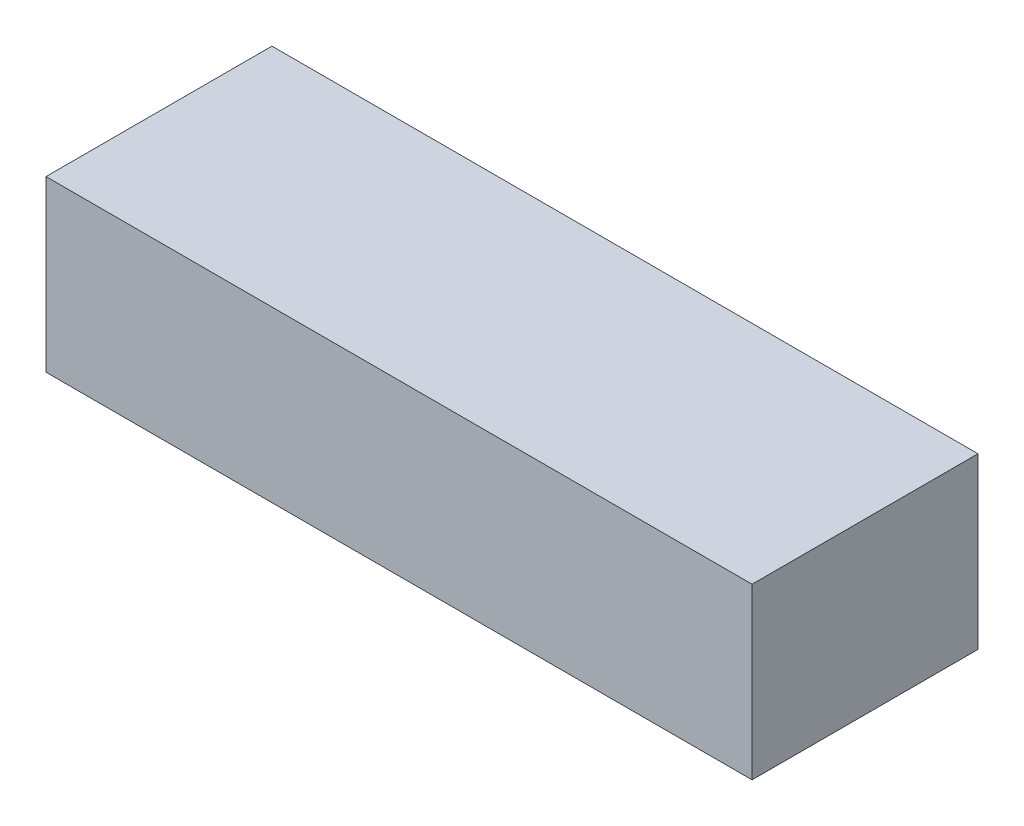
ISO-10303-21;
HEADER;
FILE_DESCRIPTION(('STEP AP214'),'2;1');
FILE_NAME('part.step','',(''),(''),'','','');
FILE_SCHEMA(('AUTOMOTIVE_DESIGN { 1 0 10303 214 1 1 1 1 }'));
ENDSEC;
DATA;
#1=APPLICATION_CONTEXT('core data for automotive mechanical design processes');
#2=APPLICATION_PROTOCOL_DEFINITION('international standard','automotive_design',2000,#1);
#3=PRODUCT_CONTEXT('',#1,'mechanical');
#4=PRODUCT('Part','Part','',(#3));
#5=PRODUCT_RELATED_PRODUCT_CATEGORY('part','',(#4));
#6=PRODUCT_DEFINITION_FORMATION('','',#4);
#7=PRODUCT_DEFINITION_CONTEXT('part definition',#1,'design');
#8=PRODUCT_DEFINITION('design','',#6,#7);
#9=PRODUCT_DEFINITION_SHAPE('','',#8);
#10=(LENGTH_UNIT() NAMED_UNIT(*) SI_UNIT(.MILLI.,.METRE.));
#11=(NAMED_UNIT(*) PLANE_ANGLE_UNIT() SI_UNIT($,.RADIAN.));
#12=(NAMED_UNIT(*) SI_UNIT($,.STERADIAN.) SOLID_ANGLE_UNIT());
#13=UNCERTAINTY_MEASURE_WITH_UNIT(LENGTH_MEASURE(1.E-05),#10,'distance_accuracy_value','');
#14=(GEOMETRIC_REPRESENTATION_CONTEXT(3) GLOBAL_UNCERTAINTY_ASSIGNED_CONTEXT((#13)) GLOBAL_UNIT_ASSIGNED_CONTEXT((#10,
#11,#12)) REPRESENTATION_CONTEXT('',''));
#15=CARTESIAN_POINT('',(0.,0.,0.));
#16=DIRECTION('',(0.,0.,1.));
#17=DIRECTION('',(1.,0.,0.));
#18=AXIS2_PLACEMENT_3D('',#15,#16,#17);
#19=CARTESIAN_POINT('',(-437.5,-210.,-280.));
#20=DIRECTION('',(-1.,0.,0.));
#21=DIRECTION('',(0.,0.,1.));
#22=AXIS2_PLACEMENT_3D('',#19,#20,#21);
#23=PLANE('',#22);
#24=DIRECTION('',(0.,0.,1.));
#25=VECTOR('',#24,1.);
#26=CARTESIAN_POINT('',(-437.5,0.,-280.));
#27=LINE('',#26,#25);
#28=CARTESIAN_POINT('',(-437.5,0.,-280.));
#29=VERTEX_POINT('',#28);
#30=CARTESIAN_POINT('',(-437.5,0.,0.));
#31=VERTEX_POINT('',#30);
#32=EDGE_CURVE('E99',#29,#31,#27,.T.);
#33=ORIENTED_EDGE('',*,*,#32,.F.);
#34=DIRECTION('',(0.,1.,0.));
#35=VECTOR('',#34,1.);
#36=CARTESIAN_POINT('',(-437.5,-210.,-280.));
#37=LINE('',#36,#35);
#38=CARTESIAN_POINT('',(-437.5,-210.,-280.));
#39=VERTEX_POINT('',#38);
#40=EDGE_CURVE('E11',#39,#29,#37,.T.);
#41=ORIENTED_EDGE('',*,*,#40,.F.);
#42=DIRECTION('',(0.,0.,1.));
#43=VECTOR('',#42,1.);
#44=CARTESIAN_POINT('',(-437.5,-210.,-280.));
#45=LINE('',#44,#43);
#46=CARTESIAN_POINT('',(-437.5,-210.,0.));
#47=VERTEX_POINT('',#46);
#48=EDGE_CURVE('E93',#39,#47,#45,.T.);
#49=ORIENTED_EDGE('',*,*,#48,.T.);
#50=DIRECTION('',(0.,1.,0.));
#51=VECTOR('',#50,1.);
#52=CARTESIAN_POINT('',(-437.5,-210.,0.));
#53=LINE('',#52,#51);
#54=EDGE_CURVE('E38',#47,#31,#53,.T.);
#55=ORIENTED_EDGE('',*,*,#54,.T.);
#56=EDGE_LOOP('',(#33,#41,#49,#55));
#57=FACE_BOUND('',#56,.T.);
#58=ADVANCED_FACE('F35',(#57),#23,.T.);
#59=CARTESIAN_POINT('',(-437.5,-210.,-280.));
#60=DIRECTION('',(0.,0.,-1.));
#61=DIRECTION('',(-1.,0.,0.));
#62=AXIS2_PLACEMENT_3D('',#59,#60,#61);
#63=PLANE('',#62);
#64=DIRECTION('',(-1.,0.,0.));
#65=VECTOR('',#64,1.);
#66=CARTESIAN_POINT('',(-437.5,0.,-280.));
#67=LINE('',#66,#65);
#68=CARTESIAN_POINT('',(437.5,0.,-280.));
#69=VERTEX_POINT('',#68);
#70=EDGE_CURVE('E95',#69,#29,#67,.T.);
#71=ORIENTED_EDGE('',*,*,#70,.F.);
#72=DIRECTION('',(0.,1.,0.));
#73=VECTOR('',#72,1.);
#74=CARTESIAN_POINT('',(437.5,-210.,-280.));
#75=LINE('',#74,#73);
#76=CARTESIAN_POINT('',(437.5,-210.,-280.));
#77=VERTEX_POINT('',#76);
#78=EDGE_CURVE('E44',#77,#69,#75,.T.);
#79=ORIENTED_EDGE('',*,*,#78,.F.);
#80=DIRECTION('',(-1.,0.,0.));
#81=VECTOR('',#80,1.);
#82=CARTESIAN_POINT('',(-437.5,-210.,-280.));
#83=LINE('',#82,#81);
#84=EDGE_CURVE('E90',#77,#39,#83,.T.);
#85=ORIENTED_EDGE('',*,*,#84,.T.);
#86=ORIENTED_EDGE('',*,*,#40,.T.);
#87=EDGE_LOOP('',(#71,#79,#85,#86));
#88=FACE_BOUND('',#87,.T.);
#89=ADVANCED_FACE('F109',(#88),#63,.T.);
#90=CARTESIAN_POINT('',(437.5,-210.,-280.));
#91=DIRECTION('',(1.,0.,0.));
#92=DIRECTION('',(0.,0.,-1.));
#93=AXIS2_PLACEMENT_3D('',#90,#91,#92);
#94=PLANE('',#93);
#95=DIRECTION('',(0.,0.,-1.));
#96=VECTOR('',#95,1.);
#97=CARTESIAN_POINT('',(437.5,0.,-280.));
#98=LINE('',#97,#96);
#99=CARTESIAN_POINT('',(437.5,0.,0.));
#100=VERTEX_POINT('',#99);
#101=EDGE_CURVE('E85',#100,#69,#98,.T.);
#102=ORIENTED_EDGE('',*,*,#101,.F.);
#103=DIRECTION('',(0.,1.,0.));
#104=VECTOR('',#103,1.);
#105=CARTESIAN_POINT('',(437.5,-210.,0.));
#106=LINE('',#105,#104);
#107=CARTESIAN_POINT('',(437.5,-210.,0.));
#108=VERTEX_POINT('',#107);
#109=EDGE_CURVE('E80',#108,#100,#106,.T.);
#110=ORIENTED_EDGE('',*,*,#109,.F.);
#111=DIRECTION('',(0.,0.,-1.));
#112=VECTOR('',#111,1.);
#113=CARTESIAN_POINT('',(437.5,-210.,-280.));
#114=LINE('',#113,#112);
#115=EDGE_CURVE('E83',#108,#77,#114,.T.);
#116=ORIENTED_EDGE('',*,*,#115,.T.);
#117=ORIENTED_EDGE('',*,*,#78,.T.);
#118=EDGE_LOOP('',(#102,#110,#116,#117));
#119=FACE_BOUND('',#118,.T.);
#120=ADVANCED_FACE('F82',(#119),#94,.T.);
#121=CARTESIAN_POINT('',(-437.5,-210.,0.));
#122=DIRECTION('',(0.,0.,1.));
#123=DIRECTION('',(1.,0.,0.));
#124=AXIS2_PLACEMENT_3D('',#121,#122,#123);
#125=PLANE('',#124);
#126=DIRECTION('',(1.,0.,0.));
#127=VECTOR('',#126,1.);
#128=CARTESIAN_POINT('',(-437.5,0.,0.));
#129=LINE('',#128,#127);
#130=EDGE_CURVE('E102',#31,#100,#129,.T.);
#131=ORIENTED_EDGE('',*,*,#130,.F.);
#132=ORIENTED_EDGE('',*,*,#54,.F.);
#133=DIRECTION('',(1.,0.,0.));
#134=VECTOR('',#133,1.);
#135=CARTESIAN_POINT('',(-437.5,-210.,0.));
#136=LINE('',#135,#134);
#137=EDGE_CURVE('E89',#47,#108,#136,.T.);
#138=ORIENTED_EDGE('',*,*,#137,.T.);
#139=ORIENTED_EDGE('',*,*,#109,.T.);
#140=EDGE_LOOP('',(#131,#132,#138,#139));
#141=FACE_BOUND('',#140,.T.);
#142=ADVANCED_FACE('F92',(#141),#125,.T.);
#143=CARTESIAN_POINT('',(0.,-210.,0.));
#144=DIRECTION('',(0.,1.,0.));
#145=DIRECTION('',(0.,0.,1.));
#146=AXIS2_PLACEMENT_3D('',#143,#144,#145);
#147=PLANE('',#146);
#148=ORIENTED_EDGE('',*,*,#48,.F.);
#149=ORIENTED_EDGE('',*,*,#84,.F.);
#150=ORIENTED_EDGE('',*,*,#115,.F.);
#151=ORIENTED_EDGE('',*,*,#137,.F.);
#152=EDGE_LOOP('',(#148,#149,#150,#151));
#153=FACE_BOUND('',#152,.T.);
#154=ADVANCED_FACE('F88',(#153),#147,.F.);
#155=CARTESIAN_POINT('',(0.,0.,0.));
#156=DIRECTION('',(0.,1.,0.));
#157=DIRECTION('',(0.,0.,1.));
#158=AXIS2_PLACEMENT_3D('',#155,#156,#157);
#159=PLANE('',#158);
#160=ORIENTED_EDGE('',*,*,#32,.T.);
#161=ORIENTED_EDGE('',*,*,#130,.T.);
#162=ORIENTED_EDGE('',*,*,#101,.T.);
#163=ORIENTED_EDGE('',*,*,#70,.T.);
#164=EDGE_LOOP('',(#160,#161,#162,#163));
#165=FACE_BOUND('',#164,.T.);
#166=ADVANCED_FACE('F108',(#165),#159,.T.);
#167=CLOSED_SHELL('',(#58,#89,#120,#142,#154,#166));
#168=MANIFOLD_SOLID_BREP('B2',#167);
#169=ADVANCED_BREP_SHAPE_REPRESENTATION('',(#18,#168),#14);
#170=SHAPE_DEFINITION_REPRESENTATION(#9,#169);
ENDSEC;
END-ISO-10303-21;
